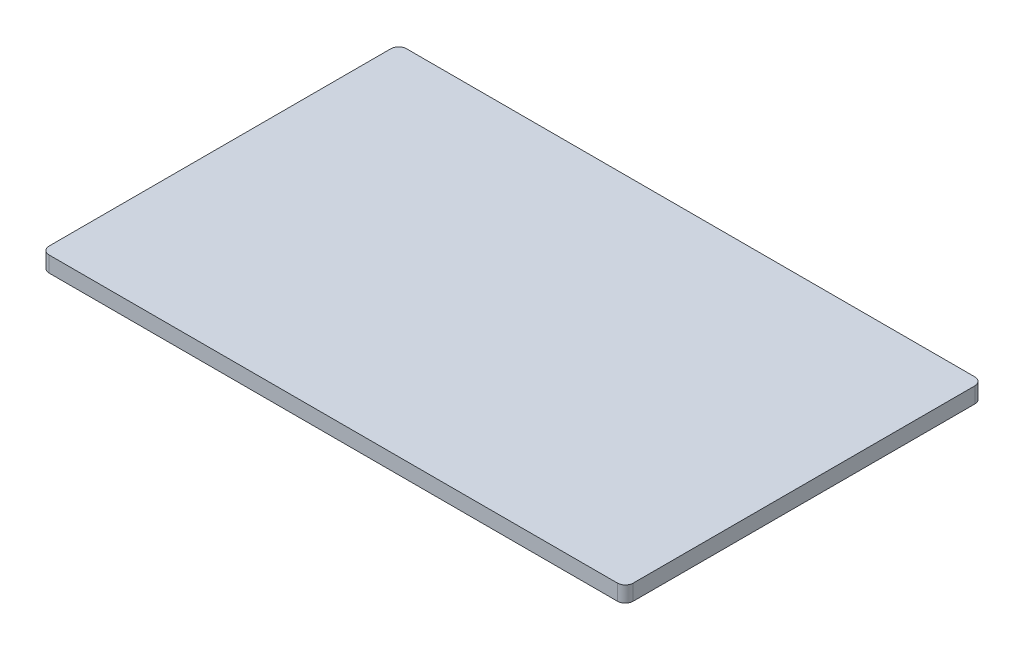
ISO-10303-21;
HEADER;
FILE_DESCRIPTION(('STEP AP214'),'2;1');
FILE_NAME('part.step','',(''),(''),'','','');
FILE_SCHEMA(('AUTOMOTIVE_DESIGN { 1 0 10303 214 1 1 1 1 }'));
ENDSEC;
DATA;
#1=APPLICATION_CONTEXT('core data for automotive mechanical design processes');
#2=APPLICATION_PROTOCOL_DEFINITION('international standard','automotive_design',2000,#1);
#3=PRODUCT_CONTEXT('',#1,'mechanical');
#4=PRODUCT('Part','Part','',(#3));
#5=PRODUCT_RELATED_PRODUCT_CATEGORY('part','',(#4));
#6=PRODUCT_DEFINITION_FORMATION('','',#4);
#7=PRODUCT_DEFINITION_CONTEXT('part definition',#1,'design');
#8=PRODUCT_DEFINITION('design','',#6,#7);
#9=PRODUCT_DEFINITION_SHAPE('','',#8);
#10=(LENGTH_UNIT() NAMED_UNIT(*) SI_UNIT(.MILLI.,.METRE.));
#11=(NAMED_UNIT(*) PLANE_ANGLE_UNIT() SI_UNIT($,.RADIAN.));
#12=(NAMED_UNIT(*) SI_UNIT($,.STERADIAN.) SOLID_ANGLE_UNIT());
#13=UNCERTAINTY_MEASURE_WITH_UNIT(LENGTH_MEASURE(1.E-05),#10,'distance_accuracy_value','');
#14=(GEOMETRIC_REPRESENTATION_CONTEXT(3) GLOBAL_UNCERTAINTY_ASSIGNED_CONTEXT((#13)) GLOBAL_UNIT_ASSIGNED_CONTEXT((#10,
#11,#12)) REPRESENTATION_CONTEXT('',''));
#15=CARTESIAN_POINT('',(0.,0.,0.));
#16=DIRECTION('',(0.,0.,1.));
#17=DIRECTION('',(1.,0.,0.));
#18=AXIS2_PLACEMENT_3D('',#15,#16,#17);
#19=CARTESIAN_POINT('',(-64.5989470687661,2.,-41.5540684992438));
#20=DIRECTION('',(1.,0.,0.));
#21=DIRECTION('',(0.,0.,-1.));
#22=AXIS2_PLACEMENT_3D('',#19,#20,#21);
#23=PLANE('',#22);
#24=DIRECTION('',(0.,0.,1.));
#25=VECTOR('',#24,1.);
#26=CARTESIAN_POINT('',(-64.5989470687661,2.,-41.5540684992438));
#27=LINE('',#26,#25);
#28=CARTESIAN_POINT('',(-64.5989470687661,2.,-40.5540684992438));
#29=VERTEX_POINT('',#28);
#30=CARTESIAN_POINT('',(-64.5989470687661,2.,2.84593150075615));
#31=VERTEX_POINT('',#30);
#32=EDGE_CURVE('E118',#29,#31,#27,.T.);
#33=ORIENTED_EDGE('',*,*,#32,.F.);
#34=DIRECTION('',(0.,-1.,0.));
#35=VECTOR('',#34,1.);
#36=CARTESIAN_POINT('',(-64.5989470687661,2.,-40.5540684992438));
#37=LINE('',#36,#35);
#38=CARTESIAN_POINT('',(-64.5989470687661,0.,-40.5540684992438));
#39=VERTEX_POINT('',#38);
#40=EDGE_CURVE('E103',#29,#39,#37,.T.);
#41=ORIENTED_EDGE('',*,*,#40,.T.);
#42=DIRECTION('',(0.,0.,1.));
#43=VECTOR('',#42,1.);
#44=CARTESIAN_POINT('',(-64.5989470687661,0.,-41.5540684992438));
#45=LINE('',#44,#43);
#46=CARTESIAN_POINT('',(-64.5989470687661,0.,2.84593150075615));
#47=VERTEX_POINT('',#46);
#48=EDGE_CURVE('E115',#39,#47,#45,.T.);
#49=ORIENTED_EDGE('',*,*,#48,.T.);
#50=DIRECTION('',(0.,-1.,0.));
#51=VECTOR('',#50,1.);
#52=CARTESIAN_POINT('',(-64.5989470687661,2.,2.84593150075615));
#53=LINE('',#52,#51);
#54=EDGE_CURVE('E120',#47,#31,#53,.F.);
#55=ORIENTED_EDGE('',*,*,#54,.T.);
#56=EDGE_LOOP('',(#33,#41,#49,#55));
#57=FACE_BOUND('',#56,.T.);
#58=ADVANCED_FACE('F33',(#57),#23,.F.);
#59=CARTESIAN_POINT('',(-64.5989470687661,2.,3.84593150075615));
#60=DIRECTION('',(0.,0.,-1.));
#61=DIRECTION('',(-1.,0.,0.));
#62=AXIS2_PLACEMENT_3D('',#59,#60,#61);
#63=PLANE('',#62);
#64=DIRECTION('',(1.,0.,0.));
#65=VECTOR('',#64,1.);
#66=CARTESIAN_POINT('',(-64.5989470687661,0.,3.84593150075615));
#67=LINE('',#66,#65);
#68=CARTESIAN_POINT('',(-63.5989470687661,0.,3.84593150075615));
#69=VERTEX_POINT('',#68);
#70=CARTESIAN_POINT('',(8.60105293123387,0.,3.84593150075615));
#71=VERTEX_POINT('',#70);
#72=EDGE_CURVE('E124',#69,#71,#67,.T.);
#73=ORIENTED_EDGE('',*,*,#72,.T.);
#74=DIRECTION('',(0.,-1.,0.));
#75=VECTOR('',#74,1.);
#76=CARTESIAN_POINT('',(8.60105293123389,2.,3.84593150075615));
#77=LINE('',#76,#75);
#78=CARTESIAN_POINT('',(8.60105293123387,2.,3.84593150075615));
#79=VERTEX_POINT('',#78);
#80=EDGE_CURVE('E11',#71,#79,#77,.F.);
#81=ORIENTED_EDGE('',*,*,#80,.T.);
#82=DIRECTION('',(1.,0.,0.));
#83=VECTOR('',#82,1.);
#84=CARTESIAN_POINT('',(-64.5989470687661,2.,3.84593150075615));
#85=LINE('',#84,#83);
#86=CARTESIAN_POINT('',(-63.5989470687661,2.,3.84593150075615));
#87=VERTEX_POINT('',#86);
#88=EDGE_CURVE('E160',#87,#79,#85,.T.);
#89=ORIENTED_EDGE('',*,*,#88,.F.);
#90=DIRECTION('',(0.,-1.,0.));
#91=VECTOR('',#90,1.);
#92=CARTESIAN_POINT('',(-63.5989470687661,2.,3.84593150075615));
#93=LINE('',#92,#91);
#94=EDGE_CURVE('E41',#87,#69,#93,.T.);
#95=ORIENTED_EDGE('',*,*,#94,.T.);
#96=EDGE_LOOP('',(#73,#81,#89,#95));
#97=FACE_BOUND('',#96,.T.);
#98=ADVANCED_FACE('F158',(#97),#63,.F.);
#99=CARTESIAN_POINT('',(9.6010529312339,2.,3.84593150075615));
#100=DIRECTION('',(-1.,0.,0.));
#101=DIRECTION('',(0.,0.,1.));
#102=AXIS2_PLACEMENT_3D('',#99,#100,#101);
#103=PLANE('',#102);
#104=DIRECTION('',(0.,0.,-1.));
#105=VECTOR('',#104,1.);
#106=CARTESIAN_POINT('',(9.6010529312339,0.,3.84593150075615));
#107=LINE('',#106,#105);
#108=CARTESIAN_POINT('',(9.6010529312339,0.,2.84593150075615));
#109=VERTEX_POINT('',#108);
#110=CARTESIAN_POINT('',(9.6010529312339,0.,-40.5540684992438));
#111=VERTEX_POINT('',#110);
#112=EDGE_CURVE('E127',#109,#111,#107,.T.);
#113=ORIENTED_EDGE('',*,*,#112,.T.);
#114=DIRECTION('',(0.,-1.,0.));
#115=VECTOR('',#114,1.);
#116=CARTESIAN_POINT('',(9.6010529312339,2.,-40.5540684992438));
#117=LINE('',#116,#115);
#118=CARTESIAN_POINT('',(9.6010529312339,2.,-40.5540684992438));
#119=VERTEX_POINT('',#118);
#120=EDGE_CURVE('E48',#111,#119,#117,.F.);
#121=ORIENTED_EDGE('',*,*,#120,.T.);
#122=DIRECTION('',(0.,0.,-1.));
#123=VECTOR('',#122,1.);
#124=CARTESIAN_POINT('',(9.6010529312339,2.,3.84593150075615));
#125=LINE('',#124,#123);
#126=CARTESIAN_POINT('',(9.6010529312339,2.,2.84593150075615));
#127=VERTEX_POINT('',#126);
#128=EDGE_CURVE('E168',#127,#119,#125,.T.);
#129=ORIENTED_EDGE('',*,*,#128,.F.);
#130=DIRECTION('',(0.,-1.,0.));
#131=VECTOR('',#130,1.);
#132=CARTESIAN_POINT('',(9.6010529312339,2.,2.84593150075615));
#133=LINE('',#132,#131);
#134=EDGE_CURVE('E151',#127,#109,#133,.T.);
#135=ORIENTED_EDGE('',*,*,#134,.T.);
#136=EDGE_LOOP('',(#113,#121,#129,#135));
#137=FACE_BOUND('',#136,.T.);
#138=ADVANCED_FACE('F167',(#137),#103,.F.);
#139=CARTESIAN_POINT('',(9.6010529312339,2.,-41.5540684992438));
#140=DIRECTION('',(0.,0.,1.));
#141=DIRECTION('',(1.,0.,0.));
#142=AXIS2_PLACEMENT_3D('',#139,#140,#141);
#143=PLANE('',#142);
#144=DIRECTION('',(-1.,0.,0.));
#145=VECTOR('',#144,1.);
#146=CARTESIAN_POINT('',(9.6010529312339,0.,-41.5540684992438));
#147=LINE('',#146,#145);
#148=CARTESIAN_POINT('',(8.6010529312339,0.,-41.5540684992438));
#149=VERTEX_POINT('',#148);
#150=CARTESIAN_POINT('',(-63.5989470687661,0.,-41.5540684992438));
#151=VERTEX_POINT('',#150);
#152=EDGE_CURVE('E134',#149,#151,#147,.T.);
#153=ORIENTED_EDGE('',*,*,#152,.T.);
#154=DIRECTION('',(0.,-1.,0.));
#155=VECTOR('',#154,1.);
#156=CARTESIAN_POINT('',(-63.5989470687661,2.,-41.5540684992438));
#157=LINE('',#156,#155);
#158=CARTESIAN_POINT('',(-63.5989470687661,2.,-41.5540684992438));
#159=VERTEX_POINT('',#158);
#160=EDGE_CURVE('E104',#151,#159,#157,.F.);
#161=ORIENTED_EDGE('',*,*,#160,.T.);
#162=DIRECTION('',(-1.,0.,0.));
#163=VECTOR('',#162,1.);
#164=CARTESIAN_POINT('',(9.6010529312339,2.,-41.5540684992438));
#165=LINE('',#164,#163);
#166=CARTESIAN_POINT('',(8.6010529312339,2.,-41.5540684992438));
#167=VERTEX_POINT('',#166);
#168=EDGE_CURVE('E130',#167,#159,#165,.T.);
#169=ORIENTED_EDGE('',*,*,#168,.F.);
#170=DIRECTION('',(0.,-1.,0.));
#171=VECTOR('',#170,1.);
#172=CARTESIAN_POINT('',(8.6010529312339,2.,-41.5540684992438));
#173=LINE('',#172,#171);
#174=EDGE_CURVE('E109',#167,#149,#173,.T.);
#175=ORIENTED_EDGE('',*,*,#174,.T.);
#176=EDGE_LOOP('',(#153,#161,#169,#175));
#177=FACE_BOUND('',#176,.T.);
#178=ADVANCED_FACE('F196',(#177),#143,.F.);
#179=CARTESIAN_POINT('',(0.,2.,0.));
#180=DIRECTION('',(0.,1.,0.));
#181=DIRECTION('',(0.,0.,1.));
#182=AXIS2_PLACEMENT_3D('',#179,#180,#181);
#183=PLANE('',#182);
#184=ORIENTED_EDGE('',*,*,#168,.T.);
#185=CARTESIAN_POINT('',(-63.5989470687661,2.,-40.5540684992438));
#186=DIRECTION('',(0.,1.,0.));
#187=DIRECTION('',(0.,0.,1.));
#188=AXIS2_PLACEMENT_3D('',#185,#186,#187);
#189=CIRCLE('',#188,1.);
#190=EDGE_CURVE('E149',#159,#29,#189,.T.);
#191=ORIENTED_EDGE('',*,*,#190,.T.);
#192=ORIENTED_EDGE('',*,*,#32,.T.);
#193=CARTESIAN_POINT('',(-63.5989470687661,2.,2.84593150075615));
#194=DIRECTION('',(0.,1.,0.));
#195=DIRECTION('',(0.,0.,1.));
#196=AXIS2_PLACEMENT_3D('',#193,#194,#195);
#197=CIRCLE('',#196,1.);
#198=EDGE_CURVE('E144',#31,#87,#197,.T.);
#199=ORIENTED_EDGE('',*,*,#198,.T.);
#200=ORIENTED_EDGE('',*,*,#88,.T.);
#201=CARTESIAN_POINT('',(8.6010529312339,2.,2.84593150075615));
#202=DIRECTION('',(0.,1.,0.));
#203=DIRECTION('',(0.,0.,1.));
#204=AXIS2_PLACEMENT_3D('',#201,#202,#203);
#205=CIRCLE('',#204,1.);
#206=EDGE_CURVE('E55',#79,#127,#205,.T.);
#207=ORIENTED_EDGE('',*,*,#206,.T.);
#208=ORIENTED_EDGE('',*,*,#128,.T.);
#209=CARTESIAN_POINT('',(8.6010529312339,2.,-40.5540684992438));
#210=DIRECTION('',(0.,1.,0.));
#211=DIRECTION('',(0.,0.,1.));
#212=AXIS2_PLACEMENT_3D('',#209,#210,#211);
#213=CIRCLE('',#212,1.);
#214=EDGE_CURVE('E147',#119,#167,#213,.T.);
#215=ORIENTED_EDGE('',*,*,#214,.T.);
#216=EDGE_LOOP('',(#184,#191,#192,#199,#200,#207,#208,#215));
#217=FACE_BOUND('',#216,.T.);
#218=ADVANCED_FACE('F173',(#217),#183,.T.);
#219=CARTESIAN_POINT('',(0.,0.,0.));
#220=DIRECTION('',(0.,1.,0.));
#221=DIRECTION('',(0.,0.,1.));
#222=AXIS2_PLACEMENT_3D('',#219,#220,#221);
#223=PLANE('',#222);
#224=ORIENTED_EDGE('',*,*,#48,.F.);
#225=CARTESIAN_POINT('',(-63.5989470687661,0.,-40.5540684992438));
#226=DIRECTION('',(0.,1.,0.));
#227=DIRECTION('',(0.,0.,1.));
#228=AXIS2_PLACEMENT_3D('',#225,#226,#227);
#229=CIRCLE('',#228,1.);
#230=EDGE_CURVE('E99',#39,#151,#229,.F.);
#231=ORIENTED_EDGE('',*,*,#230,.T.);
#232=ORIENTED_EDGE('',*,*,#152,.F.);
#233=CARTESIAN_POINT('',(8.6010529312339,0.,-40.5540684992438));
#234=DIRECTION('',(0.,1.,0.));
#235=DIRECTION('',(0.,0.,1.));
#236=AXIS2_PLACEMENT_3D('',#233,#234,#235);
#237=CIRCLE('',#236,1.);
#238=EDGE_CURVE('E110',#149,#111,#237,.F.);
#239=ORIENTED_EDGE('',*,*,#238,.T.);
#240=ORIENTED_EDGE('',*,*,#112,.F.);
#241=CARTESIAN_POINT('',(8.6010529312339,0.,2.84593150075615));
#242=DIRECTION('',(0.,1.,0.));
#243=DIRECTION('',(0.,0.,1.));
#244=AXIS2_PLACEMENT_3D('',#241,#242,#243);
#245=CIRCLE('',#244,1.);
#246=EDGE_CURVE('E138',#109,#71,#245,.F.);
#247=ORIENTED_EDGE('',*,*,#246,.T.);
#248=ORIENTED_EDGE('',*,*,#72,.F.);
#249=CARTESIAN_POINT('',(-63.5989470687661,0.,2.84593150075615));
#250=DIRECTION('',(0.,1.,0.));
#251=DIRECTION('',(0.,0.,1.));
#252=AXIS2_PLACEMENT_3D('',#249,#250,#251);
#253=CIRCLE('',#252,1.);
#254=EDGE_CURVE('E119',#69,#47,#253,.F.);
#255=ORIENTED_EDGE('',*,*,#254,.T.);
#256=EDGE_LOOP('',(#224,#231,#232,#239,#240,#247,#248,#255));
#257=FACE_BOUND('',#256,.T.);
#258=ADVANCED_FACE('F122',(#257),#223,.F.);
#259=CARTESIAN_POINT('',(-63.5989470687661,2.,-40.5540684992438));
#260=DIRECTION('',(0.,-1.,0.));
#261=DIRECTION('',(0.,0.,-1.));
#262=AXIS2_PLACEMENT_3D('',#259,#260,#261);
#263=CYLINDRICAL_SURFACE('',#262,1.);
#264=ORIENTED_EDGE('',*,*,#190,.F.);
#265=ORIENTED_EDGE('',*,*,#160,.F.);
#266=ORIENTED_EDGE('',*,*,#230,.F.);
#267=ORIENTED_EDGE('',*,*,#40,.F.);
#268=EDGE_LOOP('',(#264,#265,#266,#267));
#269=FACE_BOUND('',#268,.T.);
#270=ADVANCED_FACE('F102',(#269),#263,.T.);
#271=CARTESIAN_POINT('',(8.6010529312339,2.,-40.5540684992438));
#272=DIRECTION('',(0.,-1.,0.));
#273=DIRECTION('',(0.,0.,-1.));
#274=AXIS2_PLACEMENT_3D('',#271,#272,#273);
#275=CYLINDRICAL_SURFACE('',#274,1.);
#276=ORIENTED_EDGE('',*,*,#214,.F.);
#277=ORIENTED_EDGE('',*,*,#120,.F.);
#278=ORIENTED_EDGE('',*,*,#238,.F.);
#279=ORIENTED_EDGE('',*,*,#174,.F.);
#280=EDGE_LOOP('',(#276,#277,#278,#279));
#281=FACE_BOUND('',#280,.T.);
#282=ADVANCED_FACE('F178',(#281),#275,.T.);
#283=CARTESIAN_POINT('',(8.6010529312339,2.,2.84593150075615));
#284=DIRECTION('',(0.,-1.,0.));
#285=DIRECTION('',(0.,0.,-1.));
#286=AXIS2_PLACEMENT_3D('',#283,#284,#285);
#287=CYLINDRICAL_SURFACE('',#286,1.);
#288=ORIENTED_EDGE('',*,*,#206,.F.);
#289=ORIENTED_EDGE('',*,*,#80,.F.);
#290=ORIENTED_EDGE('',*,*,#246,.F.);
#291=ORIENTED_EDGE('',*,*,#134,.F.);
#292=EDGE_LOOP('',(#288,#289,#290,#291));
#293=FACE_BOUND('',#292,.T.);
#294=ADVANCED_FACE('F166',(#293),#287,.T.);
#295=CARTESIAN_POINT('',(-63.5989470687661,2.,2.84593150075615));
#296=DIRECTION('',(0.,-1.,0.));
#297=DIRECTION('',(0.,0.,-1.));
#298=AXIS2_PLACEMENT_3D('',#295,#296,#297);
#299=CYLINDRICAL_SURFACE('',#298,1.);
#300=ORIENTED_EDGE('',*,*,#198,.F.);
#301=ORIENTED_EDGE('',*,*,#54,.F.);
#302=ORIENTED_EDGE('',*,*,#254,.F.);
#303=ORIENTED_EDGE('',*,*,#94,.F.);
#304=EDGE_LOOP('',(#300,#301,#302,#303));
#305=FACE_BOUND('',#304,.T.);
#306=ADVANCED_FACE('F35',(#305),#299,.T.);
#307=CLOSED_SHELL('',(#58,#98,#138,#178,#218,#258,#270,#282,#294,#306));
#308=MANIFOLD_SOLID_BREP('B2',#307);
#309=ADVANCED_BREP_SHAPE_REPRESENTATION('',(#18,#308),#14);
#310=SHAPE_DEFINITION_REPRESENTATION(#9,#309);
ENDSEC;
END-ISO-10303-21;
